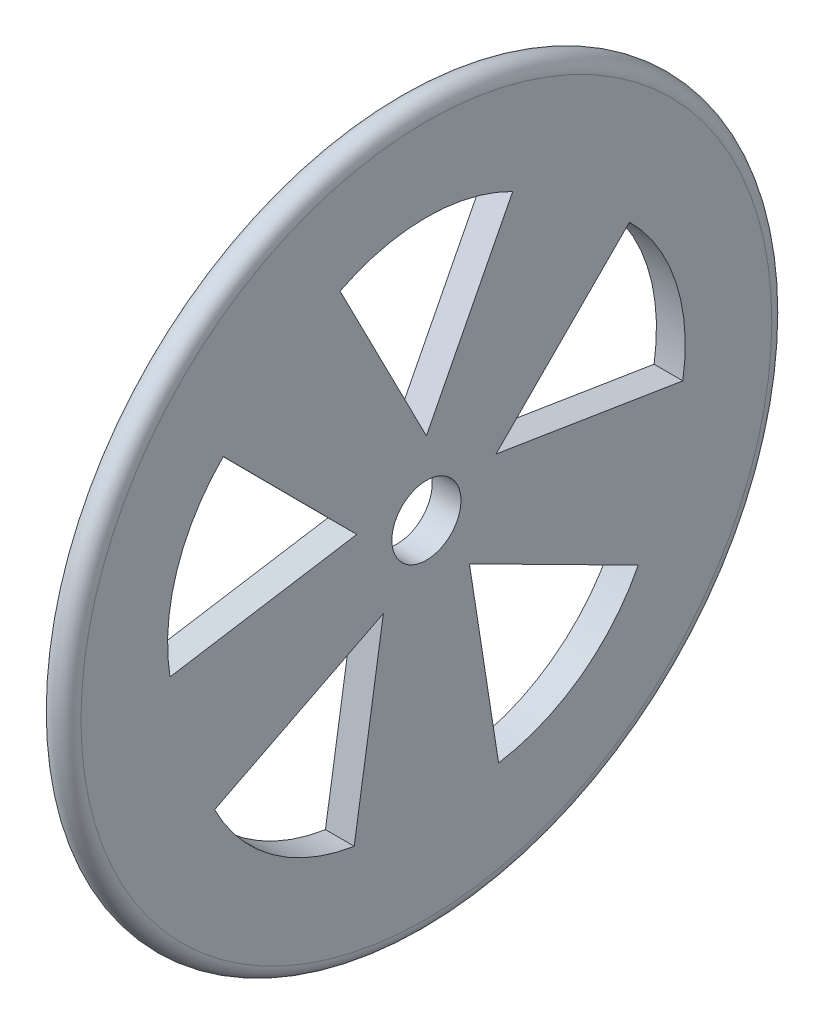
ISO-10303-21;
HEADER;
FILE_DESCRIPTION(('STEP AP214'),'2;1');
FILE_NAME('part.step','',(''),(''),'','','');
FILE_SCHEMA(('AUTOMOTIVE_DESIGN { 1 0 10303 214 1 1 1 1 }'));
ENDSEC;
DATA;
#1=APPLICATION_CONTEXT('core data for automotive mechanical design processes');
#2=APPLICATION_PROTOCOL_DEFINITION('international standard','automotive_design',2000,#1);
#3=PRODUCT_CONTEXT('',#1,'mechanical');
#4=PRODUCT('Part','Part','',(#3));
#5=PRODUCT_RELATED_PRODUCT_CATEGORY('part','',(#4));
#6=PRODUCT_DEFINITION_FORMATION('','',#4);
#7=PRODUCT_DEFINITION_CONTEXT('part definition',#1,'design');
#8=PRODUCT_DEFINITION('design','',#6,#7);
#9=PRODUCT_DEFINITION_SHAPE('','',#8);
#10=(LENGTH_UNIT() NAMED_UNIT(*) SI_UNIT(.MILLI.,.METRE.));
#11=(NAMED_UNIT(*) PLANE_ANGLE_UNIT() SI_UNIT($,.RADIAN.));
#12=(NAMED_UNIT(*) SI_UNIT($,.STERADIAN.) SOLID_ANGLE_UNIT());
#13=UNCERTAINTY_MEASURE_WITH_UNIT(LENGTH_MEASURE(1.E-05),#10,'distance_accuracy_value','');
#14=(GEOMETRIC_REPRESENTATION_CONTEXT(3) GLOBAL_UNCERTAINTY_ASSIGNED_CONTEXT((#13)) GLOBAL_UNIT_ASSIGNED_CONTEXT((#10,
#11,#12)) REPRESENTATION_CONTEXT('',''));
#15=CARTESIAN_POINT('',(0.,0.,0.));
#16=DIRECTION('',(0.,0.,1.));
#17=DIRECTION('',(1.,0.,0.));
#18=AXIS2_PLACEMENT_3D('',#15,#16,#17);
#19=CARTESIAN_POINT('',(-0.79375,0.,0.));
#20=DIRECTION('',(-1.,0.,0.));
#21=DIRECTION('',(0.,0.,1.));
#22=AXIS2_PLACEMENT_3D('',#19,#20,#21);
#23=PLANE('',#22);
#24=CARTESIAN_POINT('',(-0.79375,0.,0.));
#25=DIRECTION('',(-1.,0.,0.));
#26=DIRECTION('',(0.,0.,1.));
#27=AXIS2_PLACEMENT_3D('',#24,#25,#26);
#28=CIRCLE('',#27,1.905);
#29=CARTESIAN_POINT('',(-0.79375,0.,1.905));
#30=VERTEX_POINT('',#29);
#31=EDGE_CURVE('E308',#30,#30,#28,.T.);
#32=ORIENTED_EDGE('',*,*,#31,.F.);
#33=EDGE_LOOP('',(#32));
#34=FACE_BOUND('',#33,.T.);
#35=CARTESIAN_POINT('',(-0.79375,0.,0.));
#36=DIRECTION('',(1.,0.,0.));
#37=DIRECTION('',(0.,0.,-1.));
#38=AXIS2_PLACEMENT_3D('',#35,#36,#37);
#39=CIRCLE('',#38,19.05);
#40=CARTESIAN_POINT('',(-0.79375,0.,-19.05));
#41=VERTEX_POINT('',#40);
#42=EDGE_CURVE('E83',#41,#41,#39,.T.);
#43=ORIENTED_EDGE('',*,*,#42,.F.);
#44=EDGE_LOOP('',(#43));
#45=FACE_BOUND('',#44,.T.);
#46=CARTESIAN_POINT('',(-0.79375,4.03689743733907,0.));
#47=DIRECTION('',(-1.,0.,0.));
#48=DIRECTION('',(0.,0.,1.));
#49=AXIS2_PLACEMENT_3D('',#46,#47,#48);
#50=CIRCLE('',#49,10.4361022146316);
#51=CARTESIAN_POINT('',(-0.79375,13.3240950099457,-4.7602721226426));
#52=VERTEX_POINT('',#51);
#53=CARTESIAN_POINT('',(-0.79375,13.3240950099457,4.7602721226426));
#54=VERTEX_POINT('',#53);
#55=EDGE_CURVE('E300',#52,#54,#50,.F.);
#56=ORIENTED_EDGE('',*,*,#55,.T.);
#57=DIRECTION('',(0.,-0.889910560629218,-0.456135061227036));
#58=VECTOR('',#57,1.);
#59=CARTESIAN_POINT('',(-0.79375,0.839913627398774,-1.63865501816035));
#60=LINE('',#59,#58);
#61=CARTESIAN_POINT('',(-0.79375,4.03689743733907,0.));
#62=VERTEX_POINT('',#61);
#63=EDGE_CURVE('E304',#54,#62,#60,.T.);
#64=ORIENTED_EDGE('',*,*,#63,.T.);
#65=DIRECTION('',(0.,-0.889910560629218,0.456135061227036));
#66=VECTOR('',#65,1.);
#67=CARTESIAN_POINT('',(-0.79375,0.839913627398774,1.63865501816035));
#68=LINE('',#67,#66);
#69=EDGE_CURVE('E291',#52,#62,#68,.T.);
#70=ORIENTED_EDGE('',*,*,#69,.F.);
#71=EDGE_LOOP('',(#56,#64,#70));
#72=FACE_BOUND('',#71,.T.);
#73=CARTESIAN_POINT('',(-0.79375,1.24746991268649,3.83931761339652));
#74=DIRECTION('',(-1.,0.,0.));
#75=DIRECTION('',(0.,0.,1.));
#76=AXIS2_PLACEMENT_3D('',#73,#74,#75);
#77=CIRCLE('',#76,10.4361022146316);
#78=CARTESIAN_POINT('',(-0.79375,8.6446596143172,11.2009623991986));
#79=VERTEX_POINT('',#78);
#80=CARTESIAN_POINT('',(-0.79375,-0.409916028837591,14.1429723666905));
#81=VERTEX_POINT('',#80);
#82=EDGE_CURVE('E315',#79,#81,#77,.F.);
#83=ORIENTED_EDGE('',*,*,#82,.T.);
#84=DIRECTION('',(0.,0.158812735582485,-0.987308723255704));
#85=VECTOR('',#84,1.);
#86=CARTESIAN_POINT('',(-0.79375,1.81800111765449,0.292433079933346));
#87=LINE('',#86,#85);
#88=CARTESIAN_POINT('',(-0.79375,1.24746991268649,3.83931761339652));
#89=VERTEX_POINT('',#88);
#90=EDGE_CURVE('E319',#81,#89,#87,.T.);
#91=ORIENTED_EDGE('',*,*,#90,.T.);
#92=DIRECTION('',(0.,-0.708807708998835,-0.705401751956871));
#93=VECTOR('',#92,1.);
#94=CARTESIAN_POINT('',(-0.79375,-1.29890594830781,1.30517757699206));
#95=LINE('',#94,#93);
#96=EDGE_CURVE('E312',#79,#89,#95,.T.);
#97=ORIENTED_EDGE('',*,*,#96,.F.);
#98=EDGE_LOOP('',(#83,#91,#97));
#99=FACE_BOUND('',#98,.T.);
#100=DIRECTION('',(0.,0.45184330497999,-0.892097319660114));
#101=VECTOR('',#100,1.);
#102=CARTESIAN_POINT('',(-0.79375,-1.64268165164243,-0.832010914225025));
#103=LINE('',#102,#101);
#104=CARTESIAN_POINT('',(-0.79375,-7.98140154712411,11.6828475920571));
#105=VERTEX_POINT('',#104);
#106=CARTESIAN_POINT('',(-0.79375,-3.26591863135596,2.37282877868521));
#107=VERTEX_POINT('',#106);
#108=EDGE_CURVE('E327',#105,#107,#103,.T.);
#109=ORIENTED_EDGE('',*,*,#108,.F.);
#110=CARTESIAN_POINT('',(-0.79375,-3.26591863135596,2.37282877868521));
#111=DIRECTION('',(-1.,0.,0.));
#112=DIRECTION('',(0.,0.,1.));
#113=AXIS2_PLACEMENT_3D('',#110,#111,#112);
#114=CIRCLE('',#113,10.4361022146316);
#115=CARTESIAN_POINT('',(-0.79375,-13.5774370483008,3.98056550192278));
#116=VERTEX_POINT('',#115);
#117=EDGE_CURVE('E331',#105,#116,#114,.F.);
#118=ORIENTED_EDGE('',*,*,#117,.T.);
#119=DIRECTION('',(0.,0.988062229065549,-0.15405528713426));
#120=VECTOR('',#119,1.);
#121=CARTESIAN_POINT('',(-0.79375,0.283672854897011,1.81938860099399));
#122=LINE('',#121,#120);
#123=EDGE_CURVE('E323',#116,#107,#122,.T.);
#124=ORIENTED_EDGE('',*,*,#123,.T.);
#125=EDGE_LOOP('',(#109,#118,#124));
#126=FACE_BOUND('',#125,.T.);
#127=DIRECTION('',(0.,0.988062229065551,0.154055287134246));
#128=VECTOR('',#127,1.);
#129=CARTESIAN_POINT('',(-0.79375,0.283672854896985,-1.81938860099399));
#130=LINE('',#129,#128);
#131=CARTESIAN_POINT('',(-0.79375,-13.5774370483008,-3.98056550192258));
#132=VERTEX_POINT('',#131);
#133=CARTESIAN_POINT('',(-0.79375,-3.265918631356,-2.37282877868517));
#134=VERTEX_POINT('',#133);
#135=EDGE_CURVE('E339',#132,#134,#130,.T.);
#136=ORIENTED_EDGE('',*,*,#135,.F.);
#137=CARTESIAN_POINT('',(-0.79375,-3.265918631356,-2.37282877868517));
#138=DIRECTION('',(-1.,0.,0.));
#139=DIRECTION('',(0.,0.,1.));
#140=AXIS2_PLACEMENT_3D('',#137,#138,#139);
#141=CIRCLE('',#140,10.4361022146316);
#142=CARTESIAN_POINT('',(-0.79375,-7.98140154712428,-11.6828475920569));
#143=VERTEX_POINT('',#142);
#144=EDGE_CURVE('E342',#132,#143,#141,.F.);
#145=ORIENTED_EDGE('',*,*,#144,.T.);
#146=DIRECTION('',(0.,0.451843304980003,0.892097319660108));
#147=VECTOR('',#146,1.);
#148=CARTESIAN_POINT('',(-0.79375,-1.64268165164242,0.832010914225049));
#149=LINE('',#148,#147);
#150=EDGE_CURVE('E335',#143,#134,#149,.T.);
#151=ORIENTED_EDGE('',*,*,#150,.T.);
#152=EDGE_LOOP('',(#136,#145,#151));
#153=FACE_BOUND('',#152,.T.);
#154=DIRECTION('',(0.,0.158812735582499,0.987308723255702));
#155=VECTOR('',#154,1.);
#156=CARTESIAN_POINT('',(-0.79375,1.81800111765449,-0.292433079933372));
#157=LINE('',#156,#155);
#158=CARTESIAN_POINT('',(-0.79375,-0.409916028837785,-14.1429723666905));
#159=VERTEX_POINT('',#158);
#160=CARTESIAN_POINT('',(-0.79375,1.24746991268644,-3.83931761339654));
#161=VERTEX_POINT('',#160);
#162=EDGE_CURVE('E350',#159,#161,#157,.T.);
#163=ORIENTED_EDGE('',*,*,#162,.F.);
#164=CARTESIAN_POINT('',(-0.79375,1.24746991268644,-3.83931761339654));
#165=DIRECTION('',(-1.,0.,0.));
#166=DIRECTION('',(0.,0.,1.));
#167=AXIS2_PLACEMENT_3D('',#164,#165,#166);
#168=CIRCLE('',#167,10.4361022146316);
#169=CARTESIAN_POINT('',(-0.79375,8.64465961431704,-11.2009623991988));
#170=VERTEX_POINT('',#169);
#171=EDGE_CURVE('E189',#159,#170,#168,.F.);
#172=ORIENTED_EDGE('',*,*,#171,.T.);
#173=DIRECTION('',(0.,-0.708807708998825,0.705401751956881));
#174=VECTOR('',#173,1.);
#175=CARTESIAN_POINT('',(-0.79375,-1.29890594830783,-1.30517757699204));
#176=LINE('',#175,#174);
#177=EDGE_CURVE('E346',#170,#161,#176,.T.);
#178=ORIENTED_EDGE('',*,*,#177,.T.);
#179=EDGE_LOOP('',(#163,#172,#178));
#180=FACE_BOUND('',#179,.T.);
#181=ADVANCED_FACE('F75',(#34,#45,#72,#99,#126,#153,#180),#23,.T.);
#182=CARTESIAN_POINT('',(0.79375,0.,0.));
#183=DIRECTION('',(1.,0.,0.));
#184=DIRECTION('',(0.,0.,-1.));
#185=AXIS2_PLACEMENT_3D('',#182,#183,#184);
#186=PLANE('',#185);
#187=CARTESIAN_POINT('',(0.79375,0.,0.));
#188=DIRECTION('',(1.,0.,0.));
#189=DIRECTION('',(0.,0.,-1.));
#190=AXIS2_PLACEMENT_3D('',#187,#188,#189);
#191=CIRCLE('',#190,1.905);
#192=CARTESIAN_POINT('',(0.79375,0.,-1.905));
#193=VERTEX_POINT('',#192);
#194=EDGE_CURVE('E262',#193,#193,#191,.T.);
#195=ORIENTED_EDGE('',*,*,#194,.F.);
#196=EDGE_LOOP('',(#195));
#197=FACE_BOUND('',#196,.T.);
#198=CARTESIAN_POINT('',(0.79375,0.,0.));
#199=DIRECTION('',(1.,0.,0.));
#200=DIRECTION('',(0.,0.,-1.));
#201=AXIS2_PLACEMENT_3D('',#198,#199,#200);
#202=CIRCLE('',#201,19.05);
#203=CARTESIAN_POINT('',(0.79375,0.,-19.05));
#204=VERTEX_POINT('',#203);
#205=EDGE_CURVE('E12',#204,#204,#202,.T.);
#206=ORIENTED_EDGE('',*,*,#205,.T.);
#207=EDGE_LOOP('',(#206));
#208=FACE_BOUND('',#207,.T.);
#209=DIRECTION('',(0.,0.889910560629217,-0.456135061227036));
#210=VECTOR('',#209,1.);
#211=CARTESIAN_POINT('',(0.79375,0.839913627398774,1.63865501816035));
#212=LINE('',#211,#210);
#213=CARTESIAN_POINT('',(0.79375,4.03689743733907,0.));
#214=VERTEX_POINT('',#213);
#215=CARTESIAN_POINT('',(0.79375,13.3240950099457,-4.7602721226426));
#216=VERTEX_POINT('',#215);
#217=EDGE_CURVE('E211',#214,#216,#212,.T.);
#218=ORIENTED_EDGE('',*,*,#217,.F.);
#219=DIRECTION('',(0.,0.889910560629217,0.456135061227036));
#220=VECTOR('',#219,1.);
#221=CARTESIAN_POINT('',(0.79375,0.839913627398774,-1.63865501816035));
#222=LINE('',#221,#220);
#223=CARTESIAN_POINT('',(0.79375,13.3240950099457,4.7602721226426));
#224=VERTEX_POINT('',#223);
#225=EDGE_CURVE('E206',#214,#224,#222,.T.);
#226=ORIENTED_EDGE('',*,*,#225,.T.);
#227=CARTESIAN_POINT('',(0.79375,4.03689743733907,0.));
#228=DIRECTION('',(1.,0.,0.));
#229=DIRECTION('',(0.,0.,-1.));
#230=AXIS2_PLACEMENT_3D('',#227,#228,#229);
#231=CIRCLE('',#230,10.4361022146316);
#232=EDGE_CURVE('E283',#224,#216,#231,.F.);
#233=ORIENTED_EDGE('',*,*,#232,.T.);
#234=EDGE_LOOP('',(#218,#226,#233));
#235=FACE_BOUND('',#234,.T.);
#236=DIRECTION('',(0.,0.708807708998834,0.705401751956871));
#237=VECTOR('',#236,1.);
#238=CARTESIAN_POINT('',(0.79375,1.24746991268649,3.83931761339652));
#239=LINE('',#238,#237);
#240=CARTESIAN_POINT('',(0.79375,1.24746991268649,3.83931761339652));
#241=VERTEX_POINT('',#240);
#242=CARTESIAN_POINT('',(0.79375,8.6446596143172,11.2009623991986));
#243=VERTEX_POINT('',#242);
#244=EDGE_CURVE('E269',#241,#243,#239,.T.);
#245=ORIENTED_EDGE('',*,*,#244,.F.);
#246=DIRECTION('',(0.,-0.158812735582485,0.987308723255704));
#247=VECTOR('',#246,1.);
#248=CARTESIAN_POINT('',(0.79375,1.24746991268649,3.83931761339652));
#249=LINE('',#248,#247);
#250=CARTESIAN_POINT('',(0.79375,-0.409916028837591,14.1429723666905));
#251=VERTEX_POINT('',#250);
#252=EDGE_CURVE('E247',#241,#251,#249,.T.);
#253=ORIENTED_EDGE('',*,*,#252,.T.);
#254=CARTESIAN_POINT('',(0.79375,1.24746991268649,3.83931761339652));
#255=DIRECTION('',(-1.,0.,0.));
#256=DIRECTION('',(0.,0.,1.));
#257=AXIS2_PLACEMENT_3D('',#254,#255,#256);
#258=CIRCLE('',#257,10.4361022146316);
#259=EDGE_CURVE('E273',#251,#243,#258,.T.);
#260=ORIENTED_EDGE('',*,*,#259,.T.);
#261=EDGE_LOOP('',(#245,#253,#260));
#262=FACE_BOUND('',#261,.T.);
#263=DIRECTION('',(0.,-0.988062229065549,0.15405528713426));
#264=VECTOR('',#263,1.);
#265=CARTESIAN_POINT('',(0.79375,0.283672854897011,1.81938860099399));
#266=LINE('',#265,#264);
#267=CARTESIAN_POINT('',(0.79375,-3.26591863135596,2.37282877868521));
#268=VERTEX_POINT('',#267);
#269=CARTESIAN_POINT('',(0.79375,-13.5774370483008,3.98056550192278));
#270=VERTEX_POINT('',#269);
#271=EDGE_CURVE('E251',#268,#270,#266,.T.);
#272=ORIENTED_EDGE('',*,*,#271,.T.);
#273=CARTESIAN_POINT('',(0.79375,-3.26591863135596,2.37282877868521));
#274=DIRECTION('',(1.,0.,0.));
#275=DIRECTION('',(0.,0.,-1.));
#276=AXIS2_PLACEMENT_3D('',#273,#274,#275);
#277=CIRCLE('',#276,10.4361022146316);
#278=CARTESIAN_POINT('',(0.79375,-7.98140154712411,11.6828475920571));
#279=VERTEX_POINT('',#278);
#280=EDGE_CURVE('E225',#270,#279,#277,.F.);
#281=ORIENTED_EDGE('',*,*,#280,.T.);
#282=DIRECTION('',(0.,-0.45184330497999,0.892097319660114));
#283=VECTOR('',#282,1.);
#284=CARTESIAN_POINT('',(0.79375,-1.64268165164243,-0.832010914225025));
#285=LINE('',#284,#283);
#286=EDGE_CURVE('E240',#268,#279,#285,.T.);
#287=ORIENTED_EDGE('',*,*,#286,.F.);
#288=EDGE_LOOP('',(#272,#281,#287));
#289=FACE_BOUND('',#288,.T.);
#290=DIRECTION('',(0.,-0.451843304980003,-0.892097319660108));
#291=VECTOR('',#290,1.);
#292=CARTESIAN_POINT('',(0.79375,-1.64268165164242,0.832010914225049));
#293=LINE('',#292,#291);
#294=CARTESIAN_POINT('',(0.79375,-3.265918631356,-2.37282877868517));
#295=VERTEX_POINT('',#294);
#296=CARTESIAN_POINT('',(0.79375,-7.98140154712428,-11.6828475920569));
#297=VERTEX_POINT('',#296);
#298=EDGE_CURVE('E229',#295,#297,#293,.T.);
#299=ORIENTED_EDGE('',*,*,#298,.T.);
#300=CARTESIAN_POINT('',(0.79375,-3.265918631356,-2.37282877868517));
#301=DIRECTION('',(1.,0.,0.));
#302=DIRECTION('',(0.,0.,-1.));
#303=AXIS2_PLACEMENT_3D('',#300,#301,#302);
#304=CIRCLE('',#303,10.4361022146316);
#305=CARTESIAN_POINT('',(0.79375,-13.5774370483008,-3.98056550192258));
#306=VERTEX_POINT('',#305);
#307=EDGE_CURVE('E193',#297,#306,#304,.F.);
#308=ORIENTED_EDGE('',*,*,#307,.T.);
#309=DIRECTION('',(0.,-0.988062229065551,-0.154055287134246));
#310=VECTOR('',#309,1.);
#311=CARTESIAN_POINT('',(0.79375,0.283672854896985,-1.81938860099399));
#312=LINE('',#311,#310);
#313=EDGE_CURVE('E219',#295,#306,#312,.T.);
#314=ORIENTED_EDGE('',*,*,#313,.F.);
#315=EDGE_LOOP('',(#299,#308,#314));
#316=FACE_BOUND('',#315,.T.);
#317=DIRECTION('',(0.,0.708807708998825,-0.705401751956881));
#318=VECTOR('',#317,1.);
#319=CARTESIAN_POINT('',(0.79375,-1.29890594830783,-1.30517757699204));
#320=LINE('',#319,#318);
#321=CARTESIAN_POINT('',(0.79375,1.24746991268644,-3.83931761339654));
#322=VERTEX_POINT('',#321);
#323=CARTESIAN_POINT('',(0.79375,8.64465961431704,-11.2009623991988));
#324=VERTEX_POINT('',#323);
#325=EDGE_CURVE('E201',#322,#324,#320,.T.);
#326=ORIENTED_EDGE('',*,*,#325,.T.);
#327=CARTESIAN_POINT('',(0.79375,1.24746991268644,-3.83931761339654));
#328=DIRECTION('',(1.,0.,0.));
#329=DIRECTION('',(0.,0.,-1.));
#330=AXIS2_PLACEMENT_3D('',#327,#328,#329);
#331=CIRCLE('',#330,10.4361022146316);
#332=CARTESIAN_POINT('',(0.79375,-0.409916028837785,-14.1429723666905));
#333=VERTEX_POINT('',#332);
#334=EDGE_CURVE('E186',#324,#333,#331,.F.);
#335=ORIENTED_EDGE('',*,*,#334,.T.);
#336=DIRECTION('',(0.,-0.158812735582499,-0.987308723255702));
#337=VECTOR('',#336,1.);
#338=CARTESIAN_POINT('',(0.79375,1.81800111765449,-0.292433079933372));
#339=LINE('',#338,#337);
#340=EDGE_CURVE('E196',#322,#333,#339,.T.);
#341=ORIENTED_EDGE('',*,*,#340,.F.);
#342=EDGE_LOOP('',(#326,#335,#341));
#343=FACE_BOUND('',#342,.T.);
#344=ADVANCED_FACE('F204',(#197,#208,#235,#262,#289,#316,#343),#186,.T.);
#345=CARTESIAN_POINT('',(0.,0.,0.));
#346=DIRECTION('',(1.,0.,0.));
#347=DIRECTION('',(0.,0.,-1.));
#348=AXIS2_PLACEMENT_3D('',#345,#346,#347);
#349=TOROIDAL_SURFACE('',#348,19.05,0.79375);
#350=ORIENTED_EDGE('',*,*,#42,.T.);
#351=EDGE_LOOP('',(#350));
#352=FACE_BOUND('',#351,.T.);
#353=ORIENTED_EDGE('',*,*,#205,.F.);
#354=EDGE_LOOP('',(#353));
#355=FACE_BOUND('',#354,.T.);
#356=ADVANCED_FACE('F358',(#352,#355),#349,.T.);
#357=CARTESIAN_POINT('',(-1.74625,0.839913627398774,-1.63865501816035));
#358=DIRECTION('',(0.,0.456135061227036,-0.889910560629218));
#359=DIRECTION('',(0.,0.889910560629218,0.456135061227036));
#360=AXIS2_PLACEMENT_3D('',#357,#358,#359);
#361=PLANE('',#360);
#362=DIRECTION('',(1.,0.,0.));
#363=VECTOR('',#362,1.);
#364=CARTESIAN_POINT('',(-1.74625,13.3240950099457,4.7602721226426));
#365=LINE('',#364,#363);
#366=EDGE_CURVE('E288',#54,#224,#365,.T.);
#367=ORIENTED_EDGE('',*,*,#366,.T.);
#368=ORIENTED_EDGE('',*,*,#225,.F.);
#369=DIRECTION('',(1.,0.,0.));
#370=VECTOR('',#369,1.);
#371=CARTESIAN_POINT('',(-1.74625,4.03689743733907,0.));
#372=LINE('',#371,#370);
#373=EDGE_CURVE('E287',#62,#214,#372,.T.);
#374=ORIENTED_EDGE('',*,*,#373,.F.);
#375=ORIENTED_EDGE('',*,*,#63,.F.);
#376=EDGE_LOOP('',(#367,#368,#374,#375));
#377=FACE_BOUND('',#376,.T.);
#378=ADVANCED_FACE('F442',(#377),#361,.T.);
#379=CARTESIAN_POINT('',(-1.74625,4.03689743733907,0.));
#380=DIRECTION('',(1.,0.,0.));
#381=DIRECTION('',(0.,0.,-1.));
#382=AXIS2_PLACEMENT_3D('',#379,#380,#381);
#383=CYLINDRICAL_SURFACE('',#382,10.4361022146316);
#384=DIRECTION('',(1.,0.,0.));
#385=VECTOR('',#384,1.);
#386=CARTESIAN_POINT('',(-1.74625,13.3240950099457,-4.7602721226426));
#387=LINE('',#386,#385);
#388=EDGE_CURVE('E292',#52,#216,#387,.T.);
#389=ORIENTED_EDGE('',*,*,#388,.T.);
#390=ORIENTED_EDGE('',*,*,#232,.F.);
#391=ORIENTED_EDGE('',*,*,#366,.F.);
#392=ORIENTED_EDGE('',*,*,#55,.F.);
#393=EDGE_LOOP('',(#389,#390,#391,#392));
#394=FACE_BOUND('',#393,.T.);
#395=ADVANCED_FACE('F438',(#394),#383,.F.);
#396=CARTESIAN_POINT('',(-1.74625,0.839913627398774,1.63865501816035));
#397=DIRECTION('',(0.,-0.456135061227036,-0.889910560629218));
#398=DIRECTION('',(0.,0.889910560629218,-0.456135061227036));
#399=AXIS2_PLACEMENT_3D('',#396,#397,#398);
#400=PLANE('',#399);
#401=ORIENTED_EDGE('',*,*,#69,.T.);
#402=ORIENTED_EDGE('',*,*,#373,.T.);
#403=ORIENTED_EDGE('',*,*,#217,.T.);
#404=ORIENTED_EDGE('',*,*,#388,.F.);
#405=EDGE_LOOP('',(#401,#402,#403,#404));
#406=FACE_BOUND('',#405,.T.);
#407=ADVANCED_FACE('F441',(#406),#400,.F.);
#408=CARTESIAN_POINT('',(-1.74625,0.,0.));
#409=DIRECTION('',(1.,0.,0.));
#410=DIRECTION('',(0.,0.,-1.));
#411=AXIS2_PLACEMENT_3D('',#408,#409,#410);
#412=CYLINDRICAL_SURFACE('',#411,1.905);
#413=ORIENTED_EDGE('',*,*,#31,.T.);
#414=EDGE_LOOP('',(#413));
#415=FACE_BOUND('',#414,.T.);
#416=ORIENTED_EDGE('',*,*,#194,.T.);
#417=EDGE_LOOP('',(#416));
#418=FACE_BOUND('',#417,.T.);
#419=ADVANCED_FACE('F384',(#415,#418),#412,.F.);
#420=CARTESIAN_POINT('',(-1.74625,1.24746991268649,3.83931761339652));
#421=DIRECTION('',(0.,0.987308723255704,0.158812735582485));
#422=DIRECTION('',(0.,-0.158812735582485,0.987308723255704));
#423=AXIS2_PLACEMENT_3D('',#420,#421,#422);
#424=PLANE('',#423);
#425=DIRECTION('',(1.,0.,0.));
#426=VECTOR('',#425,1.);
#427=CARTESIAN_POINT('',(-1.74625,-0.409916028837591,14.1429723666905));
#428=LINE('',#427,#426);
#429=EDGE_CURVE('E258',#81,#251,#428,.T.);
#430=ORIENTED_EDGE('',*,*,#429,.T.);
#431=ORIENTED_EDGE('',*,*,#252,.F.);
#432=DIRECTION('',(1.,0.,0.));
#433=VECTOR('',#432,1.);
#434=CARTESIAN_POINT('',(-1.74625,1.24746991268649,3.83931761339652));
#435=LINE('',#434,#433);
#436=EDGE_CURVE('E265',#89,#241,#435,.T.);
#437=ORIENTED_EDGE('',*,*,#436,.F.);
#438=ORIENTED_EDGE('',*,*,#90,.F.);
#439=EDGE_LOOP('',(#430,#431,#437,#438));
#440=FACE_BOUND('',#439,.T.);
#441=ADVANCED_FACE('F427',(#440),#424,.T.);
#442=CARTESIAN_POINT('',(-1.74625,1.24746991268649,3.83931761339652));
#443=DIRECTION('',(1.,0.,0.));
#444=DIRECTION('',(0.,0.,-1.));
#445=AXIS2_PLACEMENT_3D('',#442,#443,#444);
#446=CYLINDRICAL_SURFACE('',#445,10.4361022146316);
#447=DIRECTION('',(1.,0.,0.));
#448=VECTOR('',#447,1.);
#449=CARTESIAN_POINT('',(-1.74625,8.6446596143172,11.2009623991986));
#450=LINE('',#449,#448);
#451=EDGE_CURVE('E261',#79,#243,#450,.T.);
#452=ORIENTED_EDGE('',*,*,#451,.T.);
#453=ORIENTED_EDGE('',*,*,#259,.F.);
#454=ORIENTED_EDGE('',*,*,#429,.F.);
#455=ORIENTED_EDGE('',*,*,#82,.F.);
#456=EDGE_LOOP('',(#452,#453,#454,#455));
#457=FACE_BOUND('',#456,.T.);
#458=ADVANCED_FACE('F430',(#457),#446,.F.);
#459=CARTESIAN_POINT('',(-1.74625,1.24746991268649,3.83931761339652));
#460=DIRECTION('',(0.,0.705401751956871,-0.708807708998835));
#461=DIRECTION('',(0.,0.708807708998835,0.705401751956871));
#462=AXIS2_PLACEMENT_3D('',#459,#460,#461);
#463=PLANE('',#462);
#464=ORIENTED_EDGE('',*,*,#96,.T.);
#465=ORIENTED_EDGE('',*,*,#436,.T.);
#466=ORIENTED_EDGE('',*,*,#244,.T.);
#467=ORIENTED_EDGE('',*,*,#451,.F.);
#468=EDGE_LOOP('',(#464,#465,#466,#467));
#469=FACE_BOUND('',#468,.T.);
#470=ADVANCED_FACE('F419',(#469),#463,.F.);
#471=CARTESIAN_POINT('',(-1.74625,-3.26591863135596,2.37282877868521));
#472=DIRECTION('',(1.,0.,0.));
#473=DIRECTION('',(0.,0.,-1.));
#474=AXIS2_PLACEMENT_3D('',#471,#472,#473);
#475=CYLINDRICAL_SURFACE('',#474,10.4361022146316);
#476=DIRECTION('',(1.,0.,0.));
#477=VECTOR('',#476,1.);
#478=CARTESIAN_POINT('',(-1.74625,-7.98140154712411,11.6828475920571));
#479=LINE('',#478,#477);
#480=EDGE_CURVE('E244',#105,#279,#479,.T.);
#481=ORIENTED_EDGE('',*,*,#480,.T.);
#482=ORIENTED_EDGE('',*,*,#280,.F.);
#483=DIRECTION('',(1.,0.,0.));
#484=VECTOR('',#483,1.);
#485=CARTESIAN_POINT('',(-1.74625,-13.5774370483008,3.98056550192278));
#486=LINE('',#485,#484);
#487=EDGE_CURVE('E236',#116,#270,#486,.T.);
#488=ORIENTED_EDGE('',*,*,#487,.F.);
#489=ORIENTED_EDGE('',*,*,#117,.F.);
#490=EDGE_LOOP('',(#481,#482,#488,#489));
#491=FACE_BOUND('',#490,.T.);
#492=ADVANCED_FACE('F415',(#491),#475,.F.);
#493=CARTESIAN_POINT('',(-1.74625,-1.64268165164243,-0.832010914225025));
#494=DIRECTION('',(0.,0.892097319660114,0.45184330497999));
#495=DIRECTION('',(0.,-0.45184330497999,0.892097319660114));
#496=AXIS2_PLACEMENT_3D('',#493,#494,#495);
#497=PLANE('',#496);
#498=ORIENTED_EDGE('',*,*,#108,.T.);
#499=DIRECTION('',(1.,0.,0.));
#500=VECTOR('',#499,1.);
#501=CARTESIAN_POINT('',(-1.74625,-3.26591863135596,2.37282877868521));
#502=LINE('',#501,#500);
#503=EDGE_CURVE('E241',#107,#268,#502,.T.);
#504=ORIENTED_EDGE('',*,*,#503,.T.);
#505=ORIENTED_EDGE('',*,*,#286,.T.);
#506=ORIENTED_EDGE('',*,*,#480,.F.);
#507=EDGE_LOOP('',(#498,#504,#505,#506));
#508=FACE_BOUND('',#507,.T.);
#509=ADVANCED_FACE('F418',(#508),#497,.F.);
#510=CARTESIAN_POINT('',(-1.74625,0.283672854897011,1.81938860099399));
#511=DIRECTION('',(0.,0.15405528713426,0.988062229065549));
#512=DIRECTION('',(0.,-0.988062229065549,0.15405528713426));
#513=AXIS2_PLACEMENT_3D('',#510,#511,#512);
#514=PLANE('',#513);
#515=ORIENTED_EDGE('',*,*,#487,.T.);
#516=ORIENTED_EDGE('',*,*,#271,.F.);
#517=ORIENTED_EDGE('',*,*,#503,.F.);
#518=ORIENTED_EDGE('',*,*,#123,.F.);
#519=EDGE_LOOP('',(#515,#516,#517,#518));
#520=FACE_BOUND('',#519,.T.);
#521=ADVANCED_FACE('F412',(#520),#514,.T.);
#522=CARTESIAN_POINT('',(-1.74625,-3.265918631356,-2.37282877868517));
#523=DIRECTION('',(1.,0.,0.));
#524=DIRECTION('',(0.,0.,-1.));
#525=AXIS2_PLACEMENT_3D('',#522,#523,#524);
#526=CYLINDRICAL_SURFACE('',#525,10.4361022146316);
#527=DIRECTION('',(1.,0.,0.));
#528=VECTOR('',#527,1.);
#529=CARTESIAN_POINT('',(-1.74625,-13.5774370483008,-3.98056550192258));
#530=LINE('',#529,#528);
#531=EDGE_CURVE('E222',#132,#306,#530,.T.);
#532=ORIENTED_EDGE('',*,*,#531,.T.);
#533=ORIENTED_EDGE('',*,*,#307,.F.);
#534=DIRECTION('',(1.,0.,0.));
#535=VECTOR('',#534,1.);
#536=CARTESIAN_POINT('',(-1.74625,-7.98140154712428,-11.6828475920569));
#537=LINE('',#536,#535);
#538=EDGE_CURVE('E215',#143,#297,#537,.T.);
#539=ORIENTED_EDGE('',*,*,#538,.F.);
#540=ORIENTED_EDGE('',*,*,#144,.F.);
#541=EDGE_LOOP('',(#532,#533,#539,#540));
#542=FACE_BOUND('',#541,.T.);
#543=ADVANCED_FACE('F401',(#542),#526,.F.);
#544=CARTESIAN_POINT('',(-1.74625,0.283672854896985,-1.81938860099399));
#545=DIRECTION('',(0.,-0.154055287134246,0.988062229065551));
#546=DIRECTION('',(0.,-0.988062229065551,-0.154055287134246));
#547=AXIS2_PLACEMENT_3D('',#544,#545,#546);
#548=PLANE('',#547);
#549=ORIENTED_EDGE('',*,*,#135,.T.);
#550=DIRECTION('',(1.,0.,0.));
#551=VECTOR('',#550,1.);
#552=CARTESIAN_POINT('',(-1.74625,-3.265918631356,-2.37282877868517));
#553=LINE('',#552,#551);
#554=EDGE_CURVE('E98',#134,#295,#553,.T.);
#555=ORIENTED_EDGE('',*,*,#554,.T.);
#556=ORIENTED_EDGE('',*,*,#313,.T.);
#557=ORIENTED_EDGE('',*,*,#531,.F.);
#558=EDGE_LOOP('',(#549,#555,#556,#557));
#559=FACE_BOUND('',#558,.T.);
#560=ADVANCED_FACE('F404',(#559),#548,.F.);
#561=CARTESIAN_POINT('',(-1.74625,-1.64268165164242,0.832010914225049));
#562=DIRECTION('',(0.,-0.892097319660108,0.451843304980003));
#563=DIRECTION('',(0.,-0.451843304980003,-0.892097319660108));
#564=AXIS2_PLACEMENT_3D('',#561,#562,#563);
#565=PLANE('',#564);
#566=ORIENTED_EDGE('',*,*,#538,.T.);
#567=ORIENTED_EDGE('',*,*,#298,.F.);
#568=ORIENTED_EDGE('',*,*,#554,.F.);
#569=ORIENTED_EDGE('',*,*,#150,.F.);
#570=EDGE_LOOP('',(#566,#567,#568,#569));
#571=FACE_BOUND('',#570,.T.);
#572=ADVANCED_FACE('F398',(#571),#565,.T.);
#573=CARTESIAN_POINT('',(-1.74625,1.24746991268644,-3.83931761339654));
#574=DIRECTION('',(1.,0.,0.));
#575=DIRECTION('',(0.,0.,-1.));
#576=AXIS2_PLACEMENT_3D('',#573,#574,#575);
#577=CYLINDRICAL_SURFACE('',#576,10.4361022146316);
#578=DIRECTION('',(1.,0.,0.));
#579=VECTOR('',#578,1.);
#580=CARTESIAN_POINT('',(-1.74625,-0.409916028837785,-14.1429723666905));
#581=LINE('',#580,#579);
#582=EDGE_CURVE('E181',#159,#333,#581,.T.);
#583=ORIENTED_EDGE('',*,*,#582,.T.);
#584=ORIENTED_EDGE('',*,*,#334,.F.);
#585=DIRECTION('',(1.,0.,0.));
#586=VECTOR('',#585,1.);
#587=CARTESIAN_POINT('',(-1.74625,8.64465961431704,-11.2009623991988));
#588=LINE('',#587,#586);
#589=EDGE_CURVE('E202',#170,#324,#588,.T.);
#590=ORIENTED_EDGE('',*,*,#589,.F.);
#591=ORIENTED_EDGE('',*,*,#171,.F.);
#592=EDGE_LOOP('',(#583,#584,#590,#591));
#593=FACE_BOUND('',#592,.T.);
#594=ADVANCED_FACE('F183',(#593),#577,.F.);
#595=CARTESIAN_POINT('',(-1.74625,1.81800111765449,-0.292433079933372));
#596=DIRECTION('',(0.,-0.987308723255701,0.158812735582499));
#597=DIRECTION('',(0.,-0.158812735582499,-0.987308723255702));
#598=AXIS2_PLACEMENT_3D('',#595,#596,#597);
#599=PLANE('',#598);
#600=ORIENTED_EDGE('',*,*,#162,.T.);
#601=DIRECTION('',(1.,0.,0.));
#602=VECTOR('',#601,1.);
#603=CARTESIAN_POINT('',(-1.74625,1.24746991268644,-3.83931761339654));
#604=LINE('',#603,#602);
#605=EDGE_CURVE('E90',#161,#322,#604,.T.);
#606=ORIENTED_EDGE('',*,*,#605,.T.);
#607=ORIENTED_EDGE('',*,*,#340,.T.);
#608=ORIENTED_EDGE('',*,*,#582,.F.);
#609=EDGE_LOOP('',(#600,#606,#607,#608));
#610=FACE_BOUND('',#609,.T.);
#611=ADVANCED_FACE('F197',(#610),#599,.F.);
#612=CARTESIAN_POINT('',(-1.74625,-1.29890594830783,-1.30517757699204));
#613=DIRECTION('',(0.,-0.705401751956881,-0.708807708998825));
#614=DIRECTION('',(0.,0.708807708998825,-0.705401751956881));
#615=AXIS2_PLACEMENT_3D('',#612,#613,#614);
#616=PLANE('',#615);
#617=ORIENTED_EDGE('',*,*,#589,.T.);
#618=ORIENTED_EDGE('',*,*,#325,.F.);
#619=ORIENTED_EDGE('',*,*,#605,.F.);
#620=ORIENTED_EDGE('',*,*,#177,.F.);
#621=EDGE_LOOP('',(#617,#618,#619,#620));
#622=FACE_BOUND('',#621,.T.);
#623=ADVANCED_FACE('F374',(#622),#616,.T.);
#624=CLOSED_SHELL('',(#181,#344,#356,#378,#395,#407,#419,#441,#458,#470,#492,#509,#521,#543,
#560,#572,#594,#611,#623));
#625=MANIFOLD_SOLID_BREP('B2',#624);
#626=ADVANCED_BREP_SHAPE_REPRESENTATION('',(#18,#625),#14);
#627=SHAPE_DEFINITION_REPRESENTATION(#9,#626);
ENDSEC;
END-ISO-10303-21;
